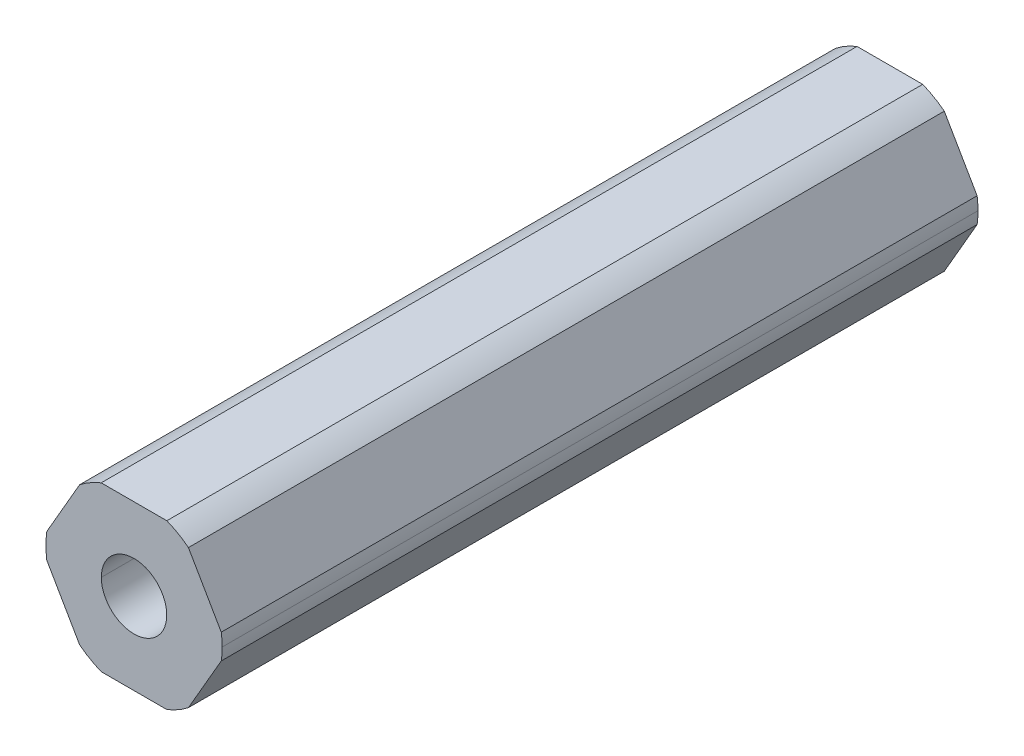
ISO-10303-21;
HEADER;
FILE_DESCRIPTION(('STEP AP214'),'2;1');
FILE_NAME('part.step','',(''),(''),'','','');
FILE_SCHEMA(('AUTOMOTIVE_DESIGN { 1 0 10303 214 1 1 1 1 }'));
ENDSEC;
DATA;
#1=APPLICATION_CONTEXT('core data for automotive mechanical design processes');
#2=APPLICATION_PROTOCOL_DEFINITION('international standard','automotive_design',2000,#1);
#3=PRODUCT_CONTEXT('',#1,'mechanical');
#4=PRODUCT('Part','Part','',(#3));
#5=PRODUCT_RELATED_PRODUCT_CATEGORY('part','',(#4));
#6=PRODUCT_DEFINITION_FORMATION('','',#4);
#7=PRODUCT_DEFINITION_CONTEXT('part definition',#1,'design');
#8=PRODUCT_DEFINITION('design','',#6,#7);
#9=PRODUCT_DEFINITION_SHAPE('','',#8);
#10=(LENGTH_UNIT() NAMED_UNIT(*) SI_UNIT(.MILLI.,.METRE.));
#11=(NAMED_UNIT(*) PLANE_ANGLE_UNIT() SI_UNIT($,.RADIAN.));
#12=(NAMED_UNIT(*) SI_UNIT($,.STERADIAN.) SOLID_ANGLE_UNIT());
#13=UNCERTAINTY_MEASURE_WITH_UNIT(LENGTH_MEASURE(1.E-05),#10,'distance_accuracy_value','');
#14=(GEOMETRIC_REPRESENTATION_CONTEXT(3) GLOBAL_UNCERTAINTY_ASSIGNED_CONTEXT((#13)) GLOBAL_UNIT_ASSIGNED_CONTEXT((#10,
#11,#12)) REPRESENTATION_CONTEXT('',''));
#15=CARTESIAN_POINT('',(0.,0.,0.));
#16=DIRECTION('',(0.,0.,1.));
#17=DIRECTION('',(1.,0.,0.));
#18=AXIS2_PLACEMENT_3D('',#15,#16,#17);
#19=CARTESIAN_POINT('',(0.,0.,-457.2));
#20=DIRECTION('',(0.,0.,1.));
#21=DIRECTION('',(1.,0.,0.));
#22=AXIS2_PLACEMENT_3D('',#19,#20,#21);
#23=CYLINDRICAL_SURFACE('',#22,2.55);
#24=CARTESIAN_POINT('',(0.,0.,-398.272));
#25=DIRECTION('',(0.,0.,1.));
#26=DIRECTION('',(1.,0.,0.));
#27=AXIS2_PLACEMENT_3D('',#24,#25,#26);
#28=CIRCLE('',#27,2.55);
#29=CARTESIAN_POINT('',(2.55,0.,-398.272));
#30=VERTEX_POINT('',#29);
#31=CARTESIAN_POINT('',(-2.55,0.,-398.272));
#32=VERTEX_POINT('',#31);
#33=EDGE_CURVE('E67',#30,#32,#28,.F.);
#34=ORIENTED_EDGE('',*,*,#33,.F.);
#35=DIRECTION('',(0.,0.,1.));
#36=VECTOR('',#35,1.);
#37=CARTESIAN_POINT('',(2.55,0.,-457.2));
#38=LINE('',#37,#36);
#39=CARTESIAN_POINT('',(2.55,0.,-457.2));
#40=VERTEX_POINT('',#39);
#41=EDGE_CURVE('E170',#40,#30,#38,.T.);
#42=ORIENTED_EDGE('',*,*,#41,.F.);
#43=CARTESIAN_POINT('',(0.,0.,-457.2));
#44=DIRECTION('',(0.,0.,1.));
#45=DIRECTION('',(1.,0.,0.));
#46=AXIS2_PLACEMENT_3D('',#43,#44,#45);
#47=CIRCLE('',#46,2.55);
#48=CARTESIAN_POINT('',(-2.55,0.,-457.2));
#49=VERTEX_POINT('',#48);
#50=EDGE_CURVE('E272',#49,#40,#47,.T.);
#51=ORIENTED_EDGE('',*,*,#50,.F.);
#52=DIRECTION('',(0.,0.,1.));
#53=VECTOR('',#52,1.);
#54=CARTESIAN_POINT('',(-2.55,0.,-457.2));
#55=LINE('',#54,#53);
#56=EDGE_CURVE('E54',#49,#32,#55,.T.);
#57=ORIENTED_EDGE('',*,*,#56,.T.);
#58=EDGE_LOOP('',(#34,#42,#51,#57));
#59=FACE_BOUND('',#58,.T.);
#60=ADVANCED_FACE('F46',(#59),#23,.F.);
#61=CARTESIAN_POINT('',(0.,0.,-457.2));
#62=DIRECTION('',(0.,0.,1.));
#63=DIRECTION('',(1.,0.,0.));
#64=AXIS2_PLACEMENT_3D('',#61,#62,#63);
#65=CYLINDRICAL_SURFACE('',#64,6.87);
#66=DIRECTION('',(0.,0.,1.));
#67=VECTOR('',#66,1.);
#68=CARTESIAN_POINT('',(6.87,0.,-457.2));
#69=LINE('',#68,#67);
#70=CARTESIAN_POINT('',(6.87,0.,-457.2));
#71=VERTEX_POINT('',#70);
#72=CARTESIAN_POINT('',(6.87,0.,-398.272));
#73=VERTEX_POINT('',#72);
#74=EDGE_CURVE('E219',#71,#73,#69,.T.);
#75=ORIENTED_EDGE('',*,*,#74,.T.);
#76=CARTESIAN_POINT('',(0.,0.,-398.272));
#77=DIRECTION('',(0.,0.,1.));
#78=DIRECTION('',(1.,0.,0.));
#79=AXIS2_PLACEMENT_3D('',#76,#77,#78);
#80=CIRCLE('',#79,6.87);
#81=CARTESIAN_POINT('',(6.80102150534208,-0.971085209378955,-398.272));
#82=VERTEX_POINT('',#81);
#83=EDGE_CURVE('E333',#73,#82,#80,.F.);
#84=ORIENTED_EDGE('',*,*,#83,.T.);
#85=DIRECTION('',(0.,0.,-1.));
#86=VECTOR('',#85,1.);
#87=CARTESIAN_POINT('',(6.80102150534208,-0.971085209378962,-457.2));
#88=LINE('',#87,#86);
#89=CARTESIAN_POINT('',(6.80102150534208,-0.971085209378955,-457.2));
#90=VERTEX_POINT('',#89);
#91=EDGE_CURVE('E222',#82,#90,#88,.T.);
#92=ORIENTED_EDGE('',*,*,#91,.T.);
#93=CARTESIAN_POINT('',(0.,0.,-457.2));
#94=DIRECTION('',(0.,0.,1.));
#95=DIRECTION('',(1.,0.,0.));
#96=AXIS2_PLACEMENT_3D('',#93,#94,#95);
#97=CIRCLE('',#96,6.87);
#98=EDGE_CURVE('E215',#90,#71,#97,.T.);
#99=ORIENTED_EDGE('',*,*,#98,.T.);
#100=EDGE_LOOP('',(#75,#84,#92,#99));
#101=FACE_BOUND('',#100,.T.);
#102=ADVANCED_FACE('F357',(#101),#65,.T.);
#103=CARTESIAN_POINT('',(3.68083890619154,-6.3754,457.2));
#104=DIRECTION('',(-0.866025403784439,0.5,0.));
#105=DIRECTION('',(0.,0.,1.));
#106=AXIS2_PLACEMENT_3D('',#103,#104,#105);
#107=PLANE('',#106);
#108=DIRECTION('',(0.5,0.866025403784439,0.));
#109=VECTOR('',#108,1.);
#110=CARTESIAN_POINT('',(3.68083890619154,-6.3754,-398.272));
#111=LINE('',#110,#109);
#112=CARTESIAN_POINT('',(4.24149521323254,-5.40431479062105,-398.272));
#113=VERTEX_POINT('',#112);
#114=EDGE_CURVE('E341',#113,#82,#111,.T.);
#115=ORIENTED_EDGE('',*,*,#114,.F.);
#116=DIRECTION('',(0.,0.,1.));
#117=VECTOR('',#116,1.);
#118=CARTESIAN_POINT('',(4.24149521323255,-5.40431479062104,-457.2));
#119=LINE('',#118,#117);
#120=CARTESIAN_POINT('',(4.24149521323254,-5.40431479062105,-457.2));
#121=VERTEX_POINT('',#120);
#122=EDGE_CURVE('E212',#121,#113,#119,.T.);
#123=ORIENTED_EDGE('',*,*,#122,.F.);
#124=DIRECTION('',(0.5,0.866025403784439,0.));
#125=VECTOR('',#124,1.);
#126=CARTESIAN_POINT('',(3.68083890619154,-6.3754,-457.2));
#127=LINE('',#126,#125);
#128=EDGE_CURVE('E240',#121,#90,#127,.T.);
#129=ORIENTED_EDGE('',*,*,#128,.T.);
#130=ORIENTED_EDGE('',*,*,#91,.F.);
#131=EDGE_LOOP('',(#115,#123,#129,#130));
#132=FACE_BOUND('',#131,.T.);
#133=ADVANCED_FACE('F355',(#132),#107,.F.);
#134=CARTESIAN_POINT('',(7.36167781238308,0.,457.2));
#135=DIRECTION('',(-0.866025403784439,-0.5,0.));
#136=DIRECTION('',(-0.5,0.866025403784439,0.));
#137=AXIS2_PLACEMENT_3D('',#134,#135,#136);
#138=PLANE('',#137);
#139=DIRECTION('',(-0.5,0.866025403784439,0.));
#140=VECTOR('',#139,1.);
#141=CARTESIAN_POINT('',(7.36167781238308,0.,-398.272));
#142=LINE('',#141,#140);
#143=CARTESIAN_POINT('',(6.80102150534208,0.97108520937895,-398.272));
#144=VERTEX_POINT('',#143);
#145=CARTESIAN_POINT('',(4.24149521323254,5.40431479062105,-398.272));
#146=VERTEX_POINT('',#145);
#147=EDGE_CURVE('E61',#144,#146,#142,.T.);
#148=ORIENTED_EDGE('',*,*,#147,.F.);
#149=DIRECTION('',(0.,0.,1.));
#150=VECTOR('',#149,1.);
#151=CARTESIAN_POINT('',(6.80102150534208,0.971085209378949,-457.2));
#152=LINE('',#151,#150);
#153=CARTESIAN_POINT('',(6.80102150534208,0.97108520937895,-457.2));
#154=VERTEX_POINT('',#153);
#155=EDGE_CURVE('E207',#154,#144,#152,.T.);
#156=ORIENTED_EDGE('',*,*,#155,.F.);
#157=DIRECTION('',(-0.5,0.866025403784439,0.));
#158=VECTOR('',#157,1.);
#159=CARTESIAN_POINT('',(7.36167781238308,0.,-457.2));
#160=LINE('',#159,#158);
#161=CARTESIAN_POINT('',(4.24149521323254,5.40431479062105,-457.2));
#162=VERTEX_POINT('',#161);
#163=EDGE_CURVE('E203',#154,#162,#160,.T.);
#164=ORIENTED_EDGE('',*,*,#163,.T.);
#165=DIRECTION('',(0.,0.,-1.));
#166=VECTOR('',#165,1.);
#167=CARTESIAN_POINT('',(4.24149521323254,5.40431479062105,-457.2));
#168=LINE('',#167,#166);
#169=EDGE_CURVE('E216',#146,#162,#168,.T.);
#170=ORIENTED_EDGE('',*,*,#169,.F.);
#171=EDGE_LOOP('',(#148,#156,#164,#170));
#172=FACE_BOUND('',#171,.T.);
#173=ADVANCED_FACE('F312',(#172),#138,.F.);
#174=CARTESIAN_POINT('',(3.68083890619154,6.3754,457.2));
#175=DIRECTION('',(0.,-1.,0.));
#176=DIRECTION('',(0.,0.,-1.));
#177=AXIS2_PLACEMENT_3D('',#174,#175,#176);
#178=PLANE('',#177);
#179=DIRECTION('',(-1.,0.,0.));
#180=VECTOR('',#179,1.);
#181=CARTESIAN_POINT('',(3.68083890619154,6.3754,-398.272));
#182=LINE('',#181,#180);
#183=CARTESIAN_POINT('',(2.55952629210953,6.3754,-398.272));
#184=VERTEX_POINT('',#183);
#185=CARTESIAN_POINT('',(-2.55952629210953,6.3754,-398.272));
#186=VERTEX_POINT('',#185);
#187=EDGE_CURVE('E321',#184,#186,#182,.T.);
#188=ORIENTED_EDGE('',*,*,#187,.F.);
#189=DIRECTION('',(0.,0.,1.));
#190=VECTOR('',#189,1.);
#191=CARTESIAN_POINT('',(2.55952629210952,6.3754,-457.2));
#192=LINE('',#191,#190);
#193=CARTESIAN_POINT('',(2.55952629210952,6.3754,-457.2));
#194=VERTEX_POINT('',#193);
#195=EDGE_CURVE('E179',#194,#184,#192,.T.);
#196=ORIENTED_EDGE('',*,*,#195,.F.);
#197=DIRECTION('',(-1.,0.,0.));
#198=VECTOR('',#197,1.);
#199=CARTESIAN_POINT('',(3.68083890619154,6.3754,-457.2));
#200=LINE('',#199,#198);
#201=CARTESIAN_POINT('',(-2.55952629210953,6.3754,-457.2));
#202=VERTEX_POINT('',#201);
#203=EDGE_CURVE('E199',#194,#202,#200,.T.);
#204=ORIENTED_EDGE('',*,*,#203,.T.);
#205=DIRECTION('',(0.,0.,-1.));
#206=VECTOR('',#205,1.);
#207=CARTESIAN_POINT('',(-2.55952629210953,6.3754,-457.2));
#208=LINE('',#207,#206);
#209=EDGE_CURVE('E198',#186,#202,#208,.T.);
#210=ORIENTED_EDGE('',*,*,#209,.F.);
#211=EDGE_LOOP('',(#188,#196,#204,#210));
#212=FACE_BOUND('',#211,.T.);
#213=ADVANCED_FACE('F48',(#212),#178,.F.);
#214=CARTESIAN_POINT('',(-3.68083890619154,6.3754,457.2));
#215=DIRECTION('',(0.866025403784439,-0.5,0.));
#216=DIRECTION('',(0.,0.,-1.));
#217=AXIS2_PLACEMENT_3D('',#214,#215,#216);
#218=PLANE('',#217);
#219=DIRECTION('',(-0.5,-0.866025403784439,0.));
#220=VECTOR('',#219,1.);
#221=CARTESIAN_POINT('',(-3.68083890619154,6.3754,-398.272));
#222=LINE('',#221,#220);
#223=CARTESIAN_POINT('',(-4.24149521323255,5.40431479062105,-398.272));
#224=VERTEX_POINT('',#223);
#225=CARTESIAN_POINT('',(-6.80102150534207,0.97108520937896,-398.272));
#226=VERTEX_POINT('',#225);
#227=EDGE_CURVE('E331',#224,#226,#222,.T.);
#228=ORIENTED_EDGE('',*,*,#227,.F.);
#229=DIRECTION('',(0.,0.,1.));
#230=VECTOR('',#229,1.);
#231=CARTESIAN_POINT('',(-4.24149521323255,5.40431479062105,-457.2));
#232=LINE('',#231,#230);
#233=CARTESIAN_POINT('',(-4.24149521323255,5.40431479062105,-457.2));
#234=VERTEX_POINT('',#233);
#235=EDGE_CURVE('E218',#234,#224,#232,.T.);
#236=ORIENTED_EDGE('',*,*,#235,.F.);
#237=DIRECTION('',(-0.5,-0.866025403784439,0.));
#238=VECTOR('',#237,1.);
#239=CARTESIAN_POINT('',(-3.68083890619154,6.3754,-457.2));
#240=LINE('',#239,#238);
#241=CARTESIAN_POINT('',(-6.80102150534208,0.97108520937896,-457.2));
#242=VERTEX_POINT('',#241);
#243=EDGE_CURVE('E204',#234,#242,#240,.T.);
#244=ORIENTED_EDGE('',*,*,#243,.T.);
#245=DIRECTION('',(0.,0.,-1.));
#246=VECTOR('',#245,1.);
#247=CARTESIAN_POINT('',(-6.80102150534208,0.97108520937896,-457.2));
#248=LINE('',#247,#246);
#249=EDGE_CURVE('E278',#226,#242,#248,.T.);
#250=ORIENTED_EDGE('',*,*,#249,.F.);
#251=EDGE_LOOP('',(#228,#236,#244,#250));
#252=FACE_BOUND('',#251,.T.);
#253=ADVANCED_FACE('F401',(#252),#218,.F.);
#254=CARTESIAN_POINT('',(-7.36167781238308,0.,457.2));
#255=DIRECTION('',(0.866025403784439,0.5,0.));
#256=DIRECTION('',(0.,0.,-1.));
#257=AXIS2_PLACEMENT_3D('',#254,#255,#256);
#258=PLANE('',#257);
#259=DIRECTION('',(0.5,-0.866025403784439,0.));
#260=VECTOR('',#259,1.);
#261=CARTESIAN_POINT('',(-7.36167781238308,0.,-398.272));
#262=LINE('',#261,#260);
#263=CARTESIAN_POINT('',(-6.80102150534208,-0.971085209378956,-398.272));
#264=VERTEX_POINT('',#263);
#265=CARTESIAN_POINT('',(-4.24149521323254,-5.40431479062105,-398.272));
#266=VERTEX_POINT('',#265);
#267=EDGE_CURVE('E339',#264,#266,#262,.T.);
#268=ORIENTED_EDGE('',*,*,#267,.F.);
#269=DIRECTION('',(0.,0.,1.));
#270=VECTOR('',#269,1.);
#271=CARTESIAN_POINT('',(-6.80102150534208,-0.971085209378962,-457.2));
#272=LINE('',#271,#270);
#273=CARTESIAN_POINT('',(-6.80102150534208,-0.971085209378956,-457.2));
#274=VERTEX_POINT('',#273);
#275=EDGE_CURVE('E194',#274,#264,#272,.T.);
#276=ORIENTED_EDGE('',*,*,#275,.F.);
#277=DIRECTION('',(0.5,-0.866025403784439,0.));
#278=VECTOR('',#277,1.);
#279=CARTESIAN_POINT('',(-7.36167781238308,0.,-457.2));
#280=LINE('',#279,#278);
#281=CARTESIAN_POINT('',(-4.24149521323254,-5.40431479062105,-457.2));
#282=VERTEX_POINT('',#281);
#283=EDGE_CURVE('E254',#274,#282,#280,.T.);
#284=ORIENTED_EDGE('',*,*,#283,.T.);
#285=DIRECTION('',(0.,0.,-1.));
#286=VECTOR('',#285,1.);
#287=CARTESIAN_POINT('',(-4.24149521323255,-5.40431479062104,-457.2));
#288=LINE('',#287,#286);
#289=EDGE_CURVE('E247',#266,#282,#288,.T.);
#290=ORIENTED_EDGE('',*,*,#289,.F.);
#291=EDGE_LOOP('',(#268,#276,#284,#290));
#292=FACE_BOUND('',#291,.T.);
#293=ADVANCED_FACE('F366',(#292),#258,.F.);
#294=CARTESIAN_POINT('',(-3.68083890619154,-6.3754,457.2));
#295=DIRECTION('',(0.,1.,0.));
#296=DIRECTION('',(1.,0.,0.));
#297=AXIS2_PLACEMENT_3D('',#294,#295,#296);
#298=PLANE('',#297);
#299=DIRECTION('',(1.,0.,0.));
#300=VECTOR('',#299,1.);
#301=CARTESIAN_POINT('',(-3.68083890619154,-6.3754,-398.272));
#302=LINE('',#301,#300);
#303=CARTESIAN_POINT('',(-2.55952629210953,-6.3754,-398.272));
#304=VERTEX_POINT('',#303);
#305=CARTESIAN_POINT('',(2.55952629210953,-6.3754,-398.272));
#306=VERTEX_POINT('',#305);
#307=EDGE_CURVE('E180',#304,#306,#302,.T.);
#308=ORIENTED_EDGE('',*,*,#307,.F.);
#309=DIRECTION('',(0.,0.,1.));
#310=VECTOR('',#309,1.);
#311=CARTESIAN_POINT('',(-2.55952629210953,-6.3754,-457.2));
#312=LINE('',#311,#310);
#313=CARTESIAN_POINT('',(-2.55952629210953,-6.3754,-457.2));
#314=VERTEX_POINT('',#313);
#315=EDGE_CURVE('E248',#314,#304,#312,.T.);
#316=ORIENTED_EDGE('',*,*,#315,.F.);
#317=DIRECTION('',(1.,0.,0.));
#318=VECTOR('',#317,1.);
#319=CARTESIAN_POINT('',(-3.68083890619154,-6.3754,-457.2));
#320=LINE('',#319,#318);
#321=CARTESIAN_POINT('',(2.55952629210953,-6.3754,-457.2));
#322=VERTEX_POINT('',#321);
#323=EDGE_CURVE('E257',#314,#322,#320,.T.);
#324=ORIENTED_EDGE('',*,*,#323,.T.);
#325=DIRECTION('',(0.,0.,-1.));
#326=VECTOR('',#325,1.);
#327=CARTESIAN_POINT('',(2.55952629210953,-6.3754,-457.2));
#328=LINE('',#327,#326);
#329=EDGE_CURVE('E291',#306,#322,#328,.T.);
#330=ORIENTED_EDGE('',*,*,#329,.F.);
#331=EDGE_LOOP('',(#308,#316,#324,#330));
#332=FACE_BOUND('',#331,.T.);
#333=ADVANCED_FACE('F348',(#332),#298,.F.);
#334=CARTESIAN_POINT('',(0.,0.,-457.2));
#335=DIRECTION('',(0.,0.,1.));
#336=DIRECTION('',(1.,0.,0.));
#337=AXIS2_PLACEMENT_3D('',#334,#335,#336);
#338=CYLINDRICAL_SURFACE('',#337,6.87);
#339=ORIENTED_EDGE('',*,*,#155,.T.);
#340=CARTESIAN_POINT('',(0.,0.,-398.272));
#341=DIRECTION('',(0.,0.,1.));
#342=DIRECTION('',(1.,0.,0.));
#343=AXIS2_PLACEMENT_3D('',#340,#341,#342);
#344=CIRCLE('',#343,6.87);
#345=EDGE_CURVE('E328',#144,#73,#344,.F.);
#346=ORIENTED_EDGE('',*,*,#345,.T.);
#347=ORIENTED_EDGE('',*,*,#74,.F.);
#348=CARTESIAN_POINT('',(0.,0.,-457.2));
#349=DIRECTION('',(0.,0.,1.));
#350=DIRECTION('',(1.,0.,0.));
#351=AXIS2_PLACEMENT_3D('',#348,#349,#350);
#352=CIRCLE('',#351,6.87);
#353=EDGE_CURVE('E211',#71,#154,#352,.T.);
#354=ORIENTED_EDGE('',*,*,#353,.T.);
#355=EDGE_LOOP('',(#339,#346,#347,#354));
#356=FACE_BOUND('',#355,.T.);
#357=ADVANCED_FACE('F358',(#356),#338,.T.);
#358=CARTESIAN_POINT('',(0.,0.,-457.2));
#359=DIRECTION('',(0.,0.,1.));
#360=DIRECTION('',(1.,0.,0.));
#361=AXIS2_PLACEMENT_3D('',#358,#359,#360);
#362=CYLINDRICAL_SURFACE('',#361,6.87);
#363=ORIENTED_EDGE('',*,*,#122,.T.);
#364=CARTESIAN_POINT('',(0.,0.,-398.272));
#365=DIRECTION('',(0.,0.,1.));
#366=DIRECTION('',(1.,0.,0.));
#367=AXIS2_PLACEMENT_3D('',#364,#365,#366);
#368=CIRCLE('',#367,6.87);
#369=EDGE_CURVE('E189',#113,#306,#368,.F.);
#370=ORIENTED_EDGE('',*,*,#369,.T.);
#371=ORIENTED_EDGE('',*,*,#329,.T.);
#372=CARTESIAN_POINT('',(0.,0.,-457.2));
#373=DIRECTION('',(0.,0.,1.));
#374=DIRECTION('',(1.,0.,0.));
#375=AXIS2_PLACEMENT_3D('',#372,#373,#374);
#376=CIRCLE('',#375,6.87);
#377=EDGE_CURVE('E238',#322,#121,#376,.T.);
#378=ORIENTED_EDGE('',*,*,#377,.T.);
#379=EDGE_LOOP('',(#363,#370,#371,#378));
#380=FACE_BOUND('',#379,.T.);
#381=ADVANCED_FACE('F345',(#380),#362,.T.);
#382=CARTESIAN_POINT('',(0.,0.,-457.2));
#383=DIRECTION('',(0.,0.,1.));
#384=DIRECTION('',(1.,0.,0.));
#385=AXIS2_PLACEMENT_3D('',#382,#383,#384);
#386=CYLINDRICAL_SURFACE('',#385,6.87);
#387=ORIENTED_EDGE('',*,*,#315,.T.);
#388=CARTESIAN_POINT('',(0.,0.,-398.272));
#389=DIRECTION('',(0.,0.,1.));
#390=DIRECTION('',(1.,0.,0.));
#391=AXIS2_PLACEMENT_3D('',#388,#389,#390);
#392=CIRCLE('',#391,6.87);
#393=EDGE_CURVE('E343',#304,#266,#392,.F.);
#394=ORIENTED_EDGE('',*,*,#393,.T.);
#395=ORIENTED_EDGE('',*,*,#289,.T.);
#396=CARTESIAN_POINT('',(0.,0.,-457.2));
#397=DIRECTION('',(0.,0.,1.));
#398=DIRECTION('',(1.,0.,0.));
#399=AXIS2_PLACEMENT_3D('',#396,#397,#398);
#400=CIRCLE('',#399,6.87);
#401=EDGE_CURVE('E243',#282,#314,#400,.T.);
#402=ORIENTED_EDGE('',*,*,#401,.T.);
#403=EDGE_LOOP('',(#387,#394,#395,#402));
#404=FACE_BOUND('',#403,.T.);
#405=ADVANCED_FACE('F349',(#404),#386,.T.);
#406=CARTESIAN_POINT('',(0.,0.,-457.2));
#407=DIRECTION('',(0.,0.,1.));
#408=DIRECTION('',(1.,0.,0.));
#409=AXIS2_PLACEMENT_3D('',#406,#407,#408);
#410=CYLINDRICAL_SURFACE('',#409,6.87);
#411=ORIENTED_EDGE('',*,*,#275,.T.);
#412=CARTESIAN_POINT('',(0.,0.,-398.272));
#413=DIRECTION('',(0.,0.,1.));
#414=DIRECTION('',(1.,0.,0.));
#415=AXIS2_PLACEMENT_3D('',#412,#413,#414);
#416=CIRCLE('',#415,6.87);
#417=EDGE_CURVE('E336',#264,#226,#416,.F.);
#418=ORIENTED_EDGE('',*,*,#417,.T.);
#419=ORIENTED_EDGE('',*,*,#249,.T.);
#420=CARTESIAN_POINT('',(0.,0.,-457.2));
#421=DIRECTION('',(0.,0.,1.));
#422=DIRECTION('',(1.,0.,0.));
#423=AXIS2_PLACEMENT_3D('',#420,#421,#422);
#424=CIRCLE('',#423,6.87);
#425=EDGE_CURVE('E197',#242,#274,#424,.T.);
#426=ORIENTED_EDGE('',*,*,#425,.T.);
#427=EDGE_LOOP('',(#411,#418,#419,#426));
#428=FACE_BOUND('',#427,.T.);
#429=ADVANCED_FACE('F390',(#428),#410,.T.);
#430=CARTESIAN_POINT('',(0.,0.,-457.2));
#431=DIRECTION('',(0.,0.,1.));
#432=DIRECTION('',(1.,0.,0.));
#433=AXIS2_PLACEMENT_3D('',#430,#431,#432);
#434=CYLINDRICAL_SURFACE('',#433,6.87);
#435=ORIENTED_EDGE('',*,*,#235,.T.);
#436=CARTESIAN_POINT('',(0.,0.,-398.272));
#437=DIRECTION('',(0.,0.,1.));
#438=DIRECTION('',(1.,0.,0.));
#439=AXIS2_PLACEMENT_3D('',#436,#437,#438);
#440=CIRCLE('',#439,6.87);
#441=EDGE_CURVE('E326',#224,#186,#440,.F.);
#442=ORIENTED_EDGE('',*,*,#441,.T.);
#443=ORIENTED_EDGE('',*,*,#209,.T.);
#444=CARTESIAN_POINT('',(0.,0.,-457.2));
#445=DIRECTION('',(0.,0.,1.));
#446=DIRECTION('',(1.,0.,0.));
#447=AXIS2_PLACEMENT_3D('',#444,#445,#446);
#448=CIRCLE('',#447,6.87);
#449=EDGE_CURVE('E206',#202,#234,#448,.T.);
#450=ORIENTED_EDGE('',*,*,#449,.T.);
#451=EDGE_LOOP('',(#435,#442,#443,#450));
#452=FACE_BOUND('',#451,.T.);
#453=ADVANCED_FACE('F386',(#452),#434,.T.);
#454=CARTESIAN_POINT('',(0.,0.,-457.2));
#455=DIRECTION('',(0.,0.,1.));
#456=DIRECTION('',(1.,0.,0.));
#457=AXIS2_PLACEMENT_3D('',#454,#455,#456);
#458=CYLINDRICAL_SURFACE('',#457,6.87);
#459=ORIENTED_EDGE('',*,*,#195,.T.);
#460=CARTESIAN_POINT('',(0.,0.,-398.272));
#461=DIRECTION('',(0.,0.,1.));
#462=DIRECTION('',(1.,0.,0.));
#463=AXIS2_PLACEMENT_3D('',#460,#461,#462);
#464=CIRCLE('',#463,6.87);
#465=EDGE_CURVE('E172',#184,#146,#464,.F.);
#466=ORIENTED_EDGE('',*,*,#465,.T.);
#467=ORIENTED_EDGE('',*,*,#169,.T.);
#468=CARTESIAN_POINT('',(0.,0.,-457.2));
#469=DIRECTION('',(0.,0.,1.));
#470=DIRECTION('',(1.,0.,0.));
#471=AXIS2_PLACEMENT_3D('',#468,#469,#470);
#472=CIRCLE('',#471,6.87);
#473=EDGE_CURVE('E187',#162,#194,#472,.T.);
#474=ORIENTED_EDGE('',*,*,#473,.T.);
#475=EDGE_LOOP('',(#459,#466,#467,#474));
#476=FACE_BOUND('',#475,.T.);
#477=ADVANCED_FACE('F319',(#476),#458,.T.);
#478=CARTESIAN_POINT('',(0.,0.,-457.2));
#479=DIRECTION('',(0.,0.,1.));
#480=DIRECTION('',(1.,0.,0.));
#481=AXIS2_PLACEMENT_3D('',#478,#479,#480);
#482=CYLINDRICAL_SURFACE('',#481,2.55);
#483=CARTESIAN_POINT('',(0.,0.,-398.272));
#484=DIRECTION('',(0.,0.,1.));
#485=DIRECTION('',(1.,0.,0.));
#486=AXIS2_PLACEMENT_3D('',#483,#484,#485);
#487=CIRCLE('',#486,2.55);
#488=EDGE_CURVE('E11',#32,#30,#487,.F.);
#489=ORIENTED_EDGE('',*,*,#488,.F.);
#490=ORIENTED_EDGE('',*,*,#56,.F.);
#491=CARTESIAN_POINT('',(0.,0.,-457.2));
#492=DIRECTION('',(0.,0.,1.));
#493=DIRECTION('',(1.,0.,0.));
#494=AXIS2_PLACEMENT_3D('',#491,#492,#493);
#495=CIRCLE('',#494,2.55);
#496=EDGE_CURVE('E177',#40,#49,#495,.T.);
#497=ORIENTED_EDGE('',*,*,#496,.F.);
#498=ORIENTED_EDGE('',*,*,#41,.T.);
#499=EDGE_LOOP('',(#489,#490,#497,#498));
#500=FACE_BOUND('',#499,.T.);
#501=ADVANCED_FACE('F175',(#500),#482,.F.);
#502=CARTESIAN_POINT('',(0.,0.,-457.2));
#503=DIRECTION('',(0.,0.,1.));
#504=DIRECTION('',(1.,0.,0.));
#505=AXIS2_PLACEMENT_3D('',#502,#503,#504);
#506=PLANE('',#505);
#507=ORIENTED_EDGE('',*,*,#473,.F.);
#508=ORIENTED_EDGE('',*,*,#163,.F.);
#509=ORIENTED_EDGE('',*,*,#353,.F.);
#510=ORIENTED_EDGE('',*,*,#98,.F.);
#511=ORIENTED_EDGE('',*,*,#128,.F.);
#512=ORIENTED_EDGE('',*,*,#377,.F.);
#513=ORIENTED_EDGE('',*,*,#323,.F.);
#514=ORIENTED_EDGE('',*,*,#401,.F.);
#515=ORIENTED_EDGE('',*,*,#283,.F.);
#516=ORIENTED_EDGE('',*,*,#425,.F.);
#517=ORIENTED_EDGE('',*,*,#243,.F.);
#518=ORIENTED_EDGE('',*,*,#449,.F.);
#519=ORIENTED_EDGE('',*,*,#203,.F.);
#520=EDGE_LOOP('',(#507,#508,#509,#510,#511,#512,#513,#514,#515,#516,#517,#518,#519));
#521=FACE_BOUND('',#520,.T.);
#522=ORIENTED_EDGE('',*,*,#496,.T.);
#523=ORIENTED_EDGE('',*,*,#50,.T.);
#524=EDGE_LOOP('',(#522,#523));
#525=FACE_BOUND('',#524,.T.);
#526=ADVANCED_FACE('F316',(#521,#525),#506,.F.);
#527=CARTESIAN_POINT('',(-0.139080358374108,0.625861612686675,-398.272));
#528=DIRECTION('',(0.,0.,1.));
#529=DIRECTION('',(1.,0.,0.));
#530=AXIS2_PLACEMENT_3D('',#527,#528,#529);
#531=PLANE('',#530);
#532=ORIENTED_EDGE('',*,*,#33,.T.);
#533=ORIENTED_EDGE('',*,*,#488,.T.);
#534=EDGE_LOOP('',(#532,#533));
#535=FACE_BOUND('',#534,.T.);
#536=ORIENTED_EDGE('',*,*,#307,.T.);
#537=ORIENTED_EDGE('',*,*,#369,.F.);
#538=ORIENTED_EDGE('',*,*,#114,.T.);
#539=ORIENTED_EDGE('',*,*,#83,.F.);
#540=ORIENTED_EDGE('',*,*,#345,.F.);
#541=ORIENTED_EDGE('',*,*,#147,.T.);
#542=ORIENTED_EDGE('',*,*,#465,.F.);
#543=ORIENTED_EDGE('',*,*,#187,.T.);
#544=ORIENTED_EDGE('',*,*,#441,.F.);
#545=ORIENTED_EDGE('',*,*,#227,.T.);
#546=ORIENTED_EDGE('',*,*,#417,.F.);
#547=ORIENTED_EDGE('',*,*,#267,.T.);
#548=ORIENTED_EDGE('',*,*,#393,.F.);
#549=EDGE_LOOP('',(#536,#537,#538,#539,#540,#541,#542,#543,#544,#545,#546,#547,#548));
#550=FACE_BOUND('',#549,.T.);
#551=ADVANCED_FACE('F164',(#535,#550),#531,.T.);
#552=CLOSED_SHELL('',(#60,#102,#133,#173,#213,#253,#293,#333,#357,#381,#405,#429,#453,#477,#501,
#526,#551));
#553=MANIFOLD_SOLID_BREP('B2',#552);
#554=ADVANCED_BREP_SHAPE_REPRESENTATION('',(#18,#553),#14);
#555=SHAPE_DEFINITION_REPRESENTATION(#9,#554);
ENDSEC;
END-ISO-10303-21;
